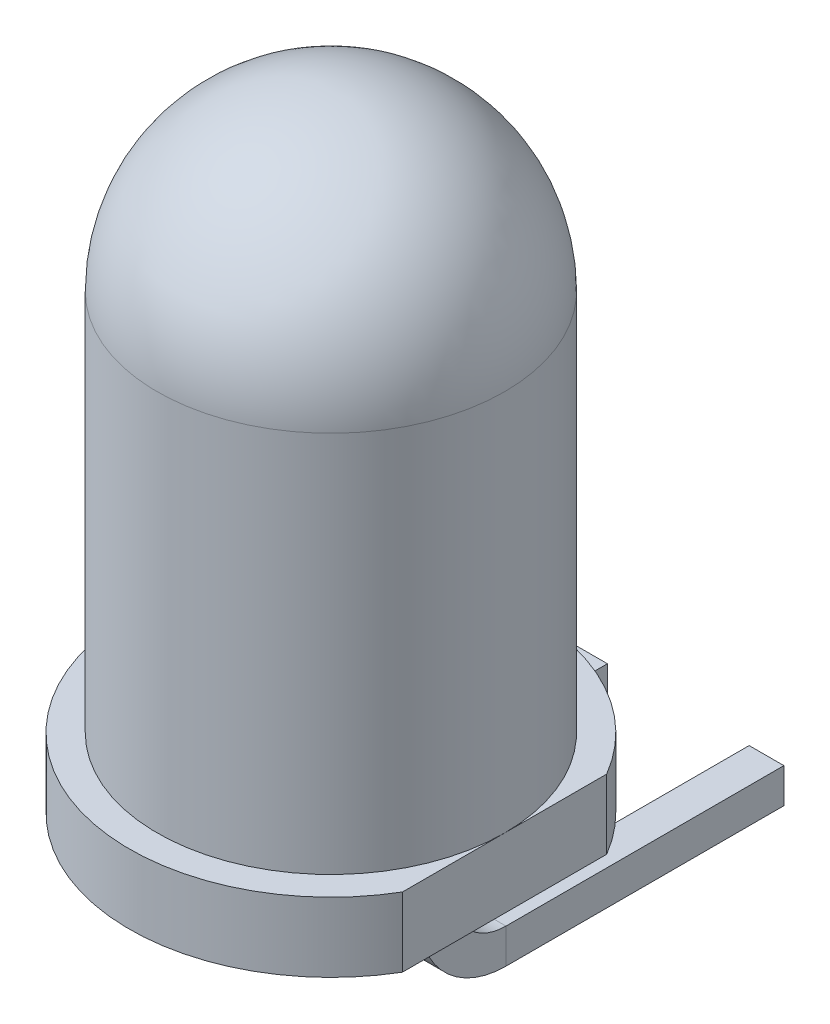
ISO-10303-21;
HEADER;
FILE_DESCRIPTION(('STEP AP214'),'2;1');
FILE_NAME('part.step','',(''),(''),'','','');
FILE_SCHEMA(('AUTOMOTIVE_DESIGN { 1 0 10303 214 1 1 1 1 }'));
ENDSEC;
DATA;
#1=APPLICATION_CONTEXT('core data for automotive mechanical design processes');
#2=APPLICATION_PROTOCOL_DEFINITION('international standard','automotive_design',2000,#1);
#3=PRODUCT_CONTEXT('',#1,'mechanical');
#4=PRODUCT('Part','Part','',(#3));
#5=PRODUCT_RELATED_PRODUCT_CATEGORY('part','',(#4));
#6=PRODUCT_DEFINITION_FORMATION('','',#4);
#7=PRODUCT_DEFINITION_CONTEXT('part definition',#1,'design');
#8=PRODUCT_DEFINITION('design','',#6,#7);
#9=PRODUCT_DEFINITION_SHAPE('','',#8);
#10=(LENGTH_UNIT() NAMED_UNIT(*) SI_UNIT(.MILLI.,.METRE.));
#11=(NAMED_UNIT(*) PLANE_ANGLE_UNIT() SI_UNIT($,.RADIAN.));
#12=(NAMED_UNIT(*) SI_UNIT($,.STERADIAN.) SOLID_ANGLE_UNIT());
#13=UNCERTAINTY_MEASURE_WITH_UNIT(LENGTH_MEASURE(1.E-05),#10,'distance_accuracy_value','');
#14=(GEOMETRIC_REPRESENTATION_CONTEXT(3) GLOBAL_UNCERTAINTY_ASSIGNED_CONTEXT((#13)) GLOBAL_UNIT_ASSIGNED_CONTEXT((#10,
#11,#12)) REPRESENTATION_CONTEXT('',''));
#15=CARTESIAN_POINT('',(0.,0.,0.));
#16=DIRECTION('',(0.,0.,1.));
#17=DIRECTION('',(1.,0.,0.));
#18=AXIS2_PLACEMENT_3D('',#15,#16,#17);
#19=CARTESIAN_POINT('',(2.9,0.,0.));
#20=DIRECTION('',(0.,1.,0.));
#21=DIRECTION('',(0.,0.,1.));
#22=AXIS2_PLACEMENT_3D('',#19,#20,#21);
#23=PLANE('',#22);
#24=DIRECTION('',(0.,0.,1.));
#25=VECTOR('',#24,1.);
#26=CARTESIAN_POINT('',(1.52,0.,-0.25));
#27=LINE('',#26,#25);
#28=CARTESIAN_POINT('',(1.52,0.,-0.25));
#29=VERTEX_POINT('',#28);
#30=CARTESIAN_POINT('',(1.52,0.,0.25));
#31=VERTEX_POINT('',#30);
#32=EDGE_CURVE('E185',#29,#31,#27,.T.);
#33=ORIENTED_EDGE('',*,*,#32,.F.);
#34=DIRECTION('',(1.,0.,0.));
#35=VECTOR('',#34,1.);
#36=CARTESIAN_POINT('',(1.02,0.,-0.25));
#37=LINE('',#36,#35);
#38=CARTESIAN_POINT('',(1.02,0.,-0.25));
#39=VERTEX_POINT('',#38);
#40=EDGE_CURVE('E178',#39,#29,#37,.T.);
#41=ORIENTED_EDGE('',*,*,#40,.F.);
#42=DIRECTION('',(0.,0.,-1.));
#43=VECTOR('',#42,1.);
#44=CARTESIAN_POINT('',(1.02,0.,-0.25));
#45=LINE('',#44,#43);
#46=CARTESIAN_POINT('',(1.02,0.,0.25));
#47=VERTEX_POINT('',#46);
#48=EDGE_CURVE('E165',#47,#39,#45,.T.);
#49=ORIENTED_EDGE('',*,*,#48,.F.);
#50=DIRECTION('',(-1.,0.,0.));
#51=VECTOR('',#50,1.);
#52=CARTESIAN_POINT('',(1.02,0.,0.25));
#53=LINE('',#52,#51);
#54=EDGE_CURVE('E172',#31,#47,#53,.T.);
#55=ORIENTED_EDGE('',*,*,#54,.F.);
#56=EDGE_LOOP('',(#33,#41,#49,#55));
#57=FACE_BOUND('',#56,.T.);
#58=DIRECTION('',(-1.,0.,0.));
#59=VECTOR('',#58,1.);
#60=CARTESIAN_POINT('',(-1.02,0.,0.25));
#61=LINE('',#60,#59);
#62=CARTESIAN_POINT('',(-1.02,0.,0.25));
#63=VERTEX_POINT('',#62);
#64=CARTESIAN_POINT('',(-1.52,0.,0.25));
#65=VERTEX_POINT('',#64);
#66=EDGE_CURVE('E252',#63,#65,#61,.T.);
#67=ORIENTED_EDGE('',*,*,#66,.F.);
#68=DIRECTION('',(0.,0.,1.));
#69=VECTOR('',#68,1.);
#70=CARTESIAN_POINT('',(-1.02,0.,-0.25));
#71=LINE('',#70,#69);
#72=CARTESIAN_POINT('',(-1.02,0.,-0.25));
#73=VERTEX_POINT('',#72);
#74=EDGE_CURVE('E250',#73,#63,#71,.T.);
#75=ORIENTED_EDGE('',*,*,#74,.F.);
#76=DIRECTION('',(1.,0.,0.));
#77=VECTOR('',#76,1.);
#78=CARTESIAN_POINT('',(-1.02,0.,-0.25));
#79=LINE('',#78,#77);
#80=CARTESIAN_POINT('',(-1.52,0.,-0.25));
#81=VERTEX_POINT('',#80);
#82=EDGE_CURVE('E263',#81,#73,#79,.T.);
#83=ORIENTED_EDGE('',*,*,#82,.F.);
#84=DIRECTION('',(0.,0.,-1.));
#85=VECTOR('',#84,1.);
#86=CARTESIAN_POINT('',(-1.52,0.,-0.25));
#87=LINE('',#86,#85);
#88=EDGE_CURVE('E286',#65,#81,#87,.T.);
#89=ORIENTED_EDGE('',*,*,#88,.F.);
#90=EDGE_LOOP('',(#67,#75,#83,#89));
#91=FACE_BOUND('',#90,.T.);
#92=CARTESIAN_POINT('',(0.,0.,0.));
#93=DIRECTION('',(0.,-1.,0.));
#94=DIRECTION('',(0.,0.,-1.));
#95=AXIS2_PLACEMENT_3D('',#92,#93,#94);
#96=CIRCLE('',#95,2.9);
#97=CARTESIAN_POINT('',(2.5,0.,1.4696938456699));
#98=VERTEX_POINT('',#97);
#99=CARTESIAN_POINT('',(2.5,0.,-1.4696938456699));
#100=VERTEX_POINT('',#99);
#101=EDGE_CURVE('E11',#98,#100,#96,.T.);
#102=ORIENTED_EDGE('',*,*,#101,.T.);
#103=DIRECTION('',(0.,0.,-1.));
#104=VECTOR('',#103,1.);
#105=CARTESIAN_POINT('',(2.5,0.,-1.4696938456699));
#106=LINE('',#105,#104);
#107=EDGE_CURVE('E324',#98,#100,#106,.T.);
#108=ORIENTED_EDGE('',*,*,#107,.F.);
#109=EDGE_LOOP('',(#102,#108));
#110=FACE_BOUND('',#109,.T.);
#111=ADVANCED_FACE('F37',(#57,#91,#110),#23,.F.);
#112=CARTESIAN_POINT('',(0.,0.,0.));
#113=DIRECTION('',(0.,-1.,0.));
#114=DIRECTION('',(0.,0.,-1.));
#115=AXIS2_PLACEMENT_3D('',#112,#113,#114);
#116=CYLINDRICAL_SURFACE('',#115,2.9);
#117=CARTESIAN_POINT('',(0.,1.,0.));
#118=DIRECTION('',(0.,-1.,0.));
#119=DIRECTION('',(0.,0.,-1.));
#120=AXIS2_PLACEMENT_3D('',#117,#118,#119);
#121=CIRCLE('',#120,2.9);
#122=CARTESIAN_POINT('',(2.5,1.,1.4696938456699));
#123=VERTEX_POINT('',#122);
#124=CARTESIAN_POINT('',(2.5,1.,-1.4696938456699));
#125=VERTEX_POINT('',#124);
#126=EDGE_CURVE('E44',#123,#125,#121,.T.);
#127=ORIENTED_EDGE('',*,*,#126,.T.);
#128=DIRECTION('',(0.,-1.,0.));
#129=VECTOR('',#128,1.);
#130=CARTESIAN_POINT('',(2.5,9.,-1.4696938456699));
#131=LINE('',#130,#129);
#132=EDGE_CURVE('E327',#125,#100,#131,.T.);
#133=ORIENTED_EDGE('',*,*,#132,.T.);
#134=ORIENTED_EDGE('',*,*,#101,.F.);
#135=DIRECTION('',(0.,-1.,0.));
#136=VECTOR('',#135,1.);
#137=CARTESIAN_POINT('',(2.5,9.,1.4696938456699));
#138=LINE('',#137,#136);
#139=EDGE_CURVE('E326',#123,#98,#138,.T.);
#140=ORIENTED_EDGE('',*,*,#139,.F.);
#141=EDGE_LOOP('',(#127,#133,#134,#140));
#142=FACE_BOUND('',#141,.T.);
#143=ADVANCED_FACE('F344',(#142),#116,.T.);
#144=CARTESIAN_POINT('',(2.5,1.,0.));
#145=DIRECTION('',(0.,-1.,0.));
#146=DIRECTION('',(0.,0.,-1.));
#147=AXIS2_PLACEMENT_3D('',#144,#145,#146);
#148=PLANE('',#147);
#149=ORIENTED_EDGE('',*,*,#126,.F.);
#150=DIRECTION('',(0.,0.,-1.));
#151=VECTOR('',#150,1.);
#152=CARTESIAN_POINT('',(2.5,1.,0.));
#153=LINE('',#152,#151);
#154=CARTESIAN_POINT('',(2.5,1.,0.));
#155=VERTEX_POINT('',#154);
#156=EDGE_CURVE('E334',#123,#155,#153,.T.);
#157=ORIENTED_EDGE('',*,*,#156,.T.);
#158=CARTESIAN_POINT('',(0.,1.,0.));
#159=DIRECTION('',(0.,-1.,0.));
#160=DIRECTION('',(0.,0.,-1.));
#161=AXIS2_PLACEMENT_3D('',#158,#159,#160);
#162=CIRCLE('',#161,2.5);
#163=EDGE_CURVE('E338',#155,#155,#162,.T.);
#164=ORIENTED_EDGE('',*,*,#163,.T.);
#165=EDGE_CURVE('E330',#155,#125,#153,.T.);
#166=ORIENTED_EDGE('',*,*,#165,.T.);
#167=EDGE_LOOP('',(#149,#157,#164,#166));
#168=FACE_BOUND('',#167,.T.);
#169=ADVANCED_FACE('F348',(#168),#148,.F.);
#170=CARTESIAN_POINT('',(0.,0.,0.));
#171=DIRECTION('',(0.,-1.,0.));
#172=DIRECTION('',(0.,0.,-1.));
#173=AXIS2_PLACEMENT_3D('',#170,#171,#172);
#174=CYLINDRICAL_SURFACE('',#173,2.5);
#175=ORIENTED_EDGE('',*,*,#163,.F.);
#176=EDGE_LOOP('',(#175));
#177=FACE_BOUND('',#176,.T.);
#178=CARTESIAN_POINT('',(0.,6.5,0.));
#179=DIRECTION('',(0.,-1.,0.));
#180=DIRECTION('',(0.,0.,-1.));
#181=AXIS2_PLACEMENT_3D('',#178,#179,#180);
#182=CIRCLE('',#181,2.5);
#183=CARTESIAN_POINT('',(0.,6.5,-2.5));
#184=VERTEX_POINT('',#183);
#185=EDGE_CURVE('E335',#184,#184,#182,.T.);
#186=ORIENTED_EDGE('',*,*,#185,.T.);
#187=EDGE_LOOP('',(#186));
#188=FACE_BOUND('',#187,.T.);
#189=ADVANCED_FACE('F361',(#177,#188),#174,.T.);
#190=CARTESIAN_POINT('',(0.,6.5,0.));
#191=DIRECTION('',(0.,-1.,0.));
#192=DIRECTION('',(1.,0.,0.));
#193=AXIS2_PLACEMENT_3D('',#190,#191,#192);
#194=SPHERICAL_SURFACE('',#193,2.5);
#195=ORIENTED_EDGE('',*,*,#185,.F.);
#196=EDGE_LOOP('',(#195));
#197=FACE_BOUND('',#196,.T.);
#198=ADVANCED_FACE('F366',(#197),#194,.T.);
#199=CARTESIAN_POINT('',(2.5,9.,-1.4696938456699));
#200=DIRECTION('',(-1.,0.,0.));
#201=DIRECTION('',(0.,0.,1.));
#202=AXIS2_PLACEMENT_3D('',#199,#200,#201);
#203=PLANE('',#202);
#204=ORIENTED_EDGE('',*,*,#139,.T.);
#205=ORIENTED_EDGE('',*,*,#107,.T.);
#206=ORIENTED_EDGE('',*,*,#132,.F.);
#207=ORIENTED_EDGE('',*,*,#165,.F.);
#208=ORIENTED_EDGE('',*,*,#156,.F.);
#209=EDGE_LOOP('',(#204,#205,#206,#207,#208));
#210=FACE_BOUND('',#209,.T.);
#211=ADVANCED_FACE('F351',(#210),#203,.F.);
#212=CARTESIAN_POINT('',(0.,-1.4,-5.));
#213=DIRECTION('',(0.,0.,-1.));
#214=DIRECTION('',(0.,1.,0.));
#215=AXIS2_PLACEMENT_3D('',#212,#213,#214);
#216=PLANE('',#215);
#217=DIRECTION('',(0.,1.,0.));
#218=VECTOR('',#217,1.);
#219=CARTESIAN_POINT('',(-1.52,-1.15,-5.));
#220=LINE('',#219,#218);
#221=CARTESIAN_POINT('',(-1.52,-1.65,-5.));
#222=VERTEX_POINT('',#221);
#223=CARTESIAN_POINT('',(-1.52,-1.15,-5.));
#224=VERTEX_POINT('',#223);
#225=EDGE_CURVE('E303',#222,#224,#220,.T.);
#226=ORIENTED_EDGE('',*,*,#225,.T.);
#227=DIRECTION('',(1.,0.,0.));
#228=VECTOR('',#227,1.);
#229=CARTESIAN_POINT('',(-1.02,-1.15,-5.));
#230=LINE('',#229,#228);
#231=CARTESIAN_POINT('',(-1.02,-1.15,-5.));
#232=VERTEX_POINT('',#231);
#233=EDGE_CURVE('E317',#224,#232,#230,.T.);
#234=ORIENTED_EDGE('',*,*,#233,.T.);
#235=DIRECTION('',(0.,-1.,0.));
#236=VECTOR('',#235,1.);
#237=CARTESIAN_POINT('',(-1.02,-1.15,-5.));
#238=LINE('',#237,#236);
#239=CARTESIAN_POINT('',(-1.02,-1.65,-5.));
#240=VERTEX_POINT('',#239);
#241=EDGE_CURVE('E275',#232,#240,#238,.T.);
#242=ORIENTED_EDGE('',*,*,#241,.T.);
#243=DIRECTION('',(-1.,0.,0.));
#244=VECTOR('',#243,1.);
#245=CARTESIAN_POINT('',(-1.02,-1.65,-5.));
#246=LINE('',#245,#244);
#247=EDGE_CURVE('E281',#240,#222,#246,.T.);
#248=ORIENTED_EDGE('',*,*,#247,.T.);
#249=EDGE_LOOP('',(#226,#234,#242,#248));
#250=FACE_BOUND('',#249,.T.);
#251=ADVANCED_FACE('F373',(#250),#216,.T.);
#252=CARTESIAN_POINT('',(-1.02,0.,-0.25));
#253=DIRECTION('',(1.,0.,0.));
#254=DIRECTION('',(0.,0.,-1.));
#255=AXIS2_PLACEMENT_3D('',#252,#253,#254);
#256=PLANE('',#255);
#257=DIRECTION('',(0.,-1.,0.));
#258=VECTOR('',#257,1.);
#259=CARTESIAN_POINT('',(-1.02,0.,0.25));
#260=LINE('',#259,#258);
#261=CARTESIAN_POINT('',(-1.02,-0.4,0.25));
#262=VERTEX_POINT('',#261);
#263=EDGE_CURVE('E256',#63,#262,#260,.T.);
#264=ORIENTED_EDGE('',*,*,#263,.T.);
#265=DIRECTION('',(0.,0.,1.));
#266=VECTOR('',#265,1.);
#267=CARTESIAN_POINT('',(-1.02,-0.4,-0.25));
#268=LINE('',#267,#266);
#269=CARTESIAN_POINT('',(-1.02,-0.4,-0.25));
#270=VERTEX_POINT('',#269);
#271=EDGE_CURVE('E253',#270,#262,#268,.T.);
#272=ORIENTED_EDGE('',*,*,#271,.F.);
#273=DIRECTION('',(0.,-1.,0.));
#274=VECTOR('',#273,1.);
#275=CARTESIAN_POINT('',(-1.02,0.,-0.25));
#276=LINE('',#275,#274);
#277=EDGE_CURVE('E257',#73,#270,#276,.T.);
#278=ORIENTED_EDGE('',*,*,#277,.F.);
#279=ORIENTED_EDGE('',*,*,#74,.T.);
#280=EDGE_LOOP('',(#264,#272,#278,#279));
#281=FACE_BOUND('',#280,.T.);
#282=ADVANCED_FACE('F377',(#281),#256,.T.);
#283=CARTESIAN_POINT('',(-1.02,0.,0.25));
#284=DIRECTION('',(0.,0.,1.));
#285=DIRECTION('',(1.,0.,0.));
#286=AXIS2_PLACEMENT_3D('',#283,#284,#285);
#287=PLANE('',#286);
#288=DIRECTION('',(0.,-1.,0.));
#289=VECTOR('',#288,1.);
#290=CARTESIAN_POINT('',(-1.52,0.,0.25));
#291=LINE('',#290,#289);
#292=CARTESIAN_POINT('',(-1.52,-0.4,0.25));
#293=VERTEX_POINT('',#292);
#294=EDGE_CURVE('E289',#65,#293,#291,.T.);
#295=ORIENTED_EDGE('',*,*,#294,.T.);
#296=DIRECTION('',(-1.,0.,0.));
#297=VECTOR('',#296,1.);
#298=CARTESIAN_POINT('',(-1.02,-0.4,0.25));
#299=LINE('',#298,#297);
#300=EDGE_CURVE('E260',#262,#293,#299,.T.);
#301=ORIENTED_EDGE('',*,*,#300,.F.);
#302=ORIENTED_EDGE('',*,*,#263,.F.);
#303=ORIENTED_EDGE('',*,*,#66,.T.);
#304=EDGE_LOOP('',(#295,#301,#302,#303));
#305=FACE_BOUND('',#304,.T.);
#306=ADVANCED_FACE('F406',(#305),#287,.T.);
#307=CARTESIAN_POINT('',(-1.52,0.,-0.25));
#308=DIRECTION('',(-1.,0.,0.));
#309=DIRECTION('',(0.,0.,1.));
#310=AXIS2_PLACEMENT_3D('',#307,#308,#309);
#311=PLANE('',#310);
#312=DIRECTION('',(0.,-1.,0.));
#313=VECTOR('',#312,1.);
#314=CARTESIAN_POINT('',(-1.52,0.,-0.25));
#315=LINE('',#314,#313);
#316=CARTESIAN_POINT('',(-1.52,-0.4,-0.25));
#317=VERTEX_POINT('',#316);
#318=EDGE_CURVE('E59',#81,#317,#315,.T.);
#319=ORIENTED_EDGE('',*,*,#318,.T.);
#320=DIRECTION('',(0.,0.,-1.));
#321=VECTOR('',#320,1.);
#322=CARTESIAN_POINT('',(-1.52,-0.4,-0.25));
#323=LINE('',#322,#321);
#324=EDGE_CURVE('E292',#293,#317,#323,.T.);
#325=ORIENTED_EDGE('',*,*,#324,.F.);
#326=ORIENTED_EDGE('',*,*,#294,.F.);
#327=ORIENTED_EDGE('',*,*,#88,.T.);
#328=EDGE_LOOP('',(#319,#325,#326,#327));
#329=FACE_BOUND('',#328,.T.);
#330=ADVANCED_FACE('F395',(#329),#311,.T.);
#331=CARTESIAN_POINT('',(-1.02,0.,-0.25));
#332=DIRECTION('',(0.,0.,-1.));
#333=DIRECTION('',(-1.,0.,0.));
#334=AXIS2_PLACEMENT_3D('',#331,#332,#333);
#335=PLANE('',#334);
#336=DIRECTION('',(1.,0.,0.));
#337=VECTOR('',#336,1.);
#338=CARTESIAN_POINT('',(-1.02,-0.4,-0.25));
#339=LINE('',#338,#337);
#340=EDGE_CURVE('E274',#317,#270,#339,.T.);
#341=ORIENTED_EDGE('',*,*,#340,.F.);
#342=ORIENTED_EDGE('',*,*,#318,.F.);
#343=ORIENTED_EDGE('',*,*,#82,.T.);
#344=ORIENTED_EDGE('',*,*,#277,.T.);
#345=EDGE_LOOP('',(#341,#342,#343,#344));
#346=FACE_BOUND('',#345,.T.);
#347=ADVANCED_FACE('F391',(#346),#335,.T.);
#348=CARTESIAN_POINT('',(-1.02,-0.4,-0.25));
#349=DIRECTION('',(1.,0.,0.));
#350=DIRECTION('',(0.,0.,-1.));
#351=AXIS2_PLACEMENT_3D('',#348,#349,#350);
#352=PLANE('',#351);
#353=CARTESIAN_POINT('',(-1.02,-0.4,-1.));
#354=DIRECTION('',(1.,0.,0.));
#355=DIRECTION('',(0.,0.,1.));
#356=AXIS2_PLACEMENT_3D('',#353,#354,#355);
#357=CIRCLE('',#356,1.25);
#358=CARTESIAN_POINT('',(-1.02,-1.65,-1.));
#359=VERTEX_POINT('',#358);
#360=EDGE_CURVE('E267',#262,#359,#357,.T.);
#361=ORIENTED_EDGE('',*,*,#360,.T.);
#362=DIRECTION('',(0.,-1.,0.));
#363=VECTOR('',#362,1.);
#364=CARTESIAN_POINT('',(-1.02,-1.15,-1.));
#365=LINE('',#364,#363);
#366=CARTESIAN_POINT('',(-1.02,-1.15,-1.));
#367=VERTEX_POINT('',#366);
#368=EDGE_CURVE('E264',#367,#359,#365,.T.);
#369=ORIENTED_EDGE('',*,*,#368,.F.);
#370=CARTESIAN_POINT('',(-1.02,-0.4,-1.));
#371=DIRECTION('',(1.,0.,0.));
#372=DIRECTION('',(0.,0.,1.));
#373=AXIS2_PLACEMENT_3D('',#370,#371,#372);
#374=CIRCLE('',#373,0.75);
#375=EDGE_CURVE('E268',#270,#367,#374,.T.);
#376=ORIENTED_EDGE('',*,*,#375,.F.);
#377=ORIENTED_EDGE('',*,*,#271,.T.);
#378=EDGE_LOOP('',(#361,#369,#376,#377));
#379=FACE_BOUND('',#378,.T.);
#380=ADVANCED_FACE('F394',(#379),#352,.T.);
#381=CARTESIAN_POINT('',(-1.27,-0.4,-1.));
#382=DIRECTION('',(1.,0.,0.));
#383=DIRECTION('',(0.,0.,-1.));
#384=AXIS2_PLACEMENT_3D('',#381,#382,#383);
#385=CYLINDRICAL_SURFACE('',#384,1.25);
#386=CARTESIAN_POINT('',(-1.52,-0.4,-1.));
#387=DIRECTION('',(1.,0.,0.));
#388=DIRECTION('',(0.,0.,1.));
#389=AXIS2_PLACEMENT_3D('',#386,#387,#388);
#390=CIRCLE('',#389,1.25);
#391=CARTESIAN_POINT('',(-1.52,-1.65,-1.));
#392=VERTEX_POINT('',#391);
#393=EDGE_CURVE('E295',#293,#392,#390,.T.);
#394=ORIENTED_EDGE('',*,*,#393,.T.);
#395=DIRECTION('',(-1.,0.,0.));
#396=VECTOR('',#395,1.);
#397=CARTESIAN_POINT('',(-1.02,-1.65,-1.));
#398=LINE('',#397,#396);
#399=EDGE_CURVE('E271',#359,#392,#398,.T.);
#400=ORIENTED_EDGE('',*,*,#399,.F.);
#401=ORIENTED_EDGE('',*,*,#360,.F.);
#402=ORIENTED_EDGE('',*,*,#300,.T.);
#403=EDGE_LOOP('',(#394,#400,#401,#402));
#404=FACE_BOUND('',#403,.T.);
#405=ADVANCED_FACE('F402',(#404),#385,.T.);
#406=CARTESIAN_POINT('',(-1.52,-0.4,-0.25));
#407=DIRECTION('',(-1.,0.,0.));
#408=DIRECTION('',(0.,0.,1.));
#409=AXIS2_PLACEMENT_3D('',#406,#407,#408);
#410=PLANE('',#409);
#411=CARTESIAN_POINT('',(-1.52,-0.4,-1.));
#412=DIRECTION('',(1.,0.,0.));
#413=DIRECTION('',(0.,0.,1.));
#414=AXIS2_PLACEMENT_3D('',#411,#412,#413);
#415=CIRCLE('',#414,0.75);
#416=CARTESIAN_POINT('',(-1.52,-1.15,-1.));
#417=VERTEX_POINT('',#416);
#418=EDGE_CURVE('E310',#317,#417,#415,.T.);
#419=ORIENTED_EDGE('',*,*,#418,.T.);
#420=DIRECTION('',(0.,1.,0.));
#421=VECTOR('',#420,1.);
#422=CARTESIAN_POINT('',(-1.52,-1.15,-1.));
#423=LINE('',#422,#421);
#424=EDGE_CURVE('E298',#392,#417,#423,.T.);
#425=ORIENTED_EDGE('',*,*,#424,.F.);
#426=ORIENTED_EDGE('',*,*,#393,.F.);
#427=ORIENTED_EDGE('',*,*,#324,.T.);
#428=EDGE_LOOP('',(#419,#425,#426,#427));
#429=FACE_BOUND('',#428,.T.);
#430=ADVANCED_FACE('F389',(#429),#410,.T.);
#431=CARTESIAN_POINT('',(-1.27,-0.4,-1.));
#432=DIRECTION('',(1.,0.,0.));
#433=DIRECTION('',(0.,0.,-1.));
#434=AXIS2_PLACEMENT_3D('',#431,#432,#433);
#435=CYLINDRICAL_SURFACE('',#434,0.75);
#436=DIRECTION('',(1.,0.,0.));
#437=VECTOR('',#436,1.);
#438=CARTESIAN_POINT('',(-1.02,-1.15,-1.));
#439=LINE('',#438,#437);
#440=EDGE_CURVE('E284',#417,#367,#439,.T.);
#441=ORIENTED_EDGE('',*,*,#440,.F.);
#442=ORIENTED_EDGE('',*,*,#418,.F.);
#443=ORIENTED_EDGE('',*,*,#340,.T.);
#444=ORIENTED_EDGE('',*,*,#375,.T.);
#445=EDGE_LOOP('',(#441,#442,#443,#444));
#446=FACE_BOUND('',#445,.T.);
#447=ADVANCED_FACE('F385',(#446),#435,.F.);
#448=CARTESIAN_POINT('',(-1.02,-1.15,-1.));
#449=DIRECTION('',(1.,0.,0.));
#450=DIRECTION('',(0.,0.,-1.));
#451=AXIS2_PLACEMENT_3D('',#448,#449,#450);
#452=PLANE('',#451);
#453=DIRECTION('',(0.,0.,-1.));
#454=VECTOR('',#453,1.);
#455=CARTESIAN_POINT('',(-1.02,-1.65,-1.));
#456=LINE('',#455,#454);
#457=EDGE_CURVE('E277',#359,#240,#456,.T.);
#458=ORIENTED_EDGE('',*,*,#457,.T.);
#459=ORIENTED_EDGE('',*,*,#241,.F.);
#460=DIRECTION('',(0.,0.,-1.));
#461=VECTOR('',#460,1.);
#462=CARTESIAN_POINT('',(-1.02,-1.15,-1.));
#463=LINE('',#462,#461);
#464=EDGE_CURVE('E278',#367,#232,#463,.T.);
#465=ORIENTED_EDGE('',*,*,#464,.F.);
#466=ORIENTED_EDGE('',*,*,#368,.T.);
#467=EDGE_LOOP('',(#458,#459,#465,#466));
#468=FACE_BOUND('',#467,.T.);
#469=ADVANCED_FACE('F388',(#468),#452,.T.);
#470=CARTESIAN_POINT('',(-1.02,-1.65,-1.));
#471=DIRECTION('',(0.,-1.,0.));
#472=DIRECTION('',(0.,0.,-1.));
#473=AXIS2_PLACEMENT_3D('',#470,#471,#472);
#474=PLANE('',#473);
#475=DIRECTION('',(0.,0.,-1.));
#476=VECTOR('',#475,1.);
#477=CARTESIAN_POINT('',(-1.52,-1.65,-1.));
#478=LINE('',#477,#476);
#479=EDGE_CURVE('E300',#392,#222,#478,.T.);
#480=ORIENTED_EDGE('',*,*,#479,.T.);
#481=ORIENTED_EDGE('',*,*,#247,.F.);
#482=ORIENTED_EDGE('',*,*,#457,.F.);
#483=ORIENTED_EDGE('',*,*,#399,.T.);
#484=EDGE_LOOP('',(#480,#481,#482,#483));
#485=FACE_BOUND('',#484,.T.);
#486=ADVANCED_FACE('F398',(#485),#474,.T.);
#487=CARTESIAN_POINT('',(-1.52,-1.15,-1.));
#488=DIRECTION('',(-1.,0.,0.));
#489=DIRECTION('',(0.,0.,1.));
#490=AXIS2_PLACEMENT_3D('',#487,#488,#489);
#491=PLANE('',#490);
#492=DIRECTION('',(0.,0.,-1.));
#493=VECTOR('',#492,1.);
#494=CARTESIAN_POINT('',(-1.52,-1.15,-1.));
#495=LINE('',#494,#493);
#496=EDGE_CURVE('E314',#417,#224,#495,.T.);
#497=ORIENTED_EDGE('',*,*,#496,.T.);
#498=ORIENTED_EDGE('',*,*,#225,.F.);
#499=ORIENTED_EDGE('',*,*,#479,.F.);
#500=ORIENTED_EDGE('',*,*,#424,.T.);
#501=EDGE_LOOP('',(#497,#498,#499,#500));
#502=FACE_BOUND('',#501,.T.);
#503=ADVANCED_FACE('F383',(#502),#491,.T.);
#504=CARTESIAN_POINT('',(-1.02,-1.15,-1.));
#505=DIRECTION('',(0.,1.,0.));
#506=DIRECTION('',(0.,0.,1.));
#507=AXIS2_PLACEMENT_3D('',#504,#505,#506);
#508=PLANE('',#507);
#509=ORIENTED_EDGE('',*,*,#233,.F.);
#510=ORIENTED_EDGE('',*,*,#496,.F.);
#511=ORIENTED_EDGE('',*,*,#440,.T.);
#512=ORIENTED_EDGE('',*,*,#464,.T.);
#513=EDGE_LOOP('',(#509,#510,#511,#512));
#514=FACE_BOUND('',#513,.T.);
#515=ADVANCED_FACE('F374',(#514),#508,.T.);
#516=CARTESIAN_POINT('',(0.,-1.4,-5.));
#517=DIRECTION('',(0.,0.,-1.));
#518=DIRECTION('',(0.,1.,0.));
#519=AXIS2_PLACEMENT_3D('',#516,#517,#518);
#520=PLANE('',#519);
#521=DIRECTION('',(1.,0.,0.));
#522=VECTOR('',#521,1.);
#523=CARTESIAN_POINT('',(1.02,-1.15,-5.));
#524=LINE('',#523,#522);
#525=CARTESIAN_POINT('',(1.02,-1.15,-5.));
#526=VERTEX_POINT('',#525);
#527=CARTESIAN_POINT('',(1.52,-1.15,-5.));
#528=VERTEX_POINT('',#527);
#529=EDGE_CURVE('E204',#526,#528,#524,.T.);
#530=ORIENTED_EDGE('',*,*,#529,.T.);
#531=DIRECTION('',(0.,-1.,0.));
#532=VECTOR('',#531,1.);
#533=CARTESIAN_POINT('',(1.52,-1.15,-5.));
#534=LINE('',#533,#532);
#535=CARTESIAN_POINT('',(1.52,-1.65,-5.));
#536=VERTEX_POINT('',#535);
#537=EDGE_CURVE('E210',#528,#536,#534,.T.);
#538=ORIENTED_EDGE('',*,*,#537,.T.);
#539=DIRECTION('',(-1.,0.,0.));
#540=VECTOR('',#539,1.);
#541=CARTESIAN_POINT('',(1.02,-1.65,-5.));
#542=LINE('',#541,#540);
#543=CARTESIAN_POINT('',(1.02,-1.65,-5.));
#544=VERTEX_POINT('',#543);
#545=EDGE_CURVE('E230',#536,#544,#542,.T.);
#546=ORIENTED_EDGE('',*,*,#545,.T.);
#547=DIRECTION('',(0.,1.,0.));
#548=VECTOR('',#547,1.);
#549=CARTESIAN_POINT('',(1.02,-1.15,-5.));
#550=LINE('',#549,#548);
#551=EDGE_CURVE('E243',#544,#526,#550,.T.);
#552=ORIENTED_EDGE('',*,*,#551,.T.);
#553=EDGE_LOOP('',(#530,#538,#546,#552));
#554=FACE_BOUND('',#553,.T.);
#555=ADVANCED_FACE('F382',(#554),#520,.T.);
#556=CARTESIAN_POINT('',(1.02,0.,-0.25));
#557=DIRECTION('',(0.,0.,-1.));
#558=DIRECTION('',(-1.,0.,0.));
#559=AXIS2_PLACEMENT_3D('',#556,#557,#558);
#560=PLANE('',#559);
#561=DIRECTION('',(0.,-1.,0.));
#562=VECTOR('',#561,1.);
#563=CARTESIAN_POINT('',(1.52,0.,-0.25));
#564=LINE('',#563,#562);
#565=CARTESIAN_POINT('',(1.52,-0.4,-0.25));
#566=VERTEX_POINT('',#565);
#567=EDGE_CURVE('E190',#29,#566,#564,.T.);
#568=ORIENTED_EDGE('',*,*,#567,.T.);
#569=DIRECTION('',(1.,0.,0.));
#570=VECTOR('',#569,1.);
#571=CARTESIAN_POINT('',(1.02,-0.4,-0.25));
#572=LINE('',#571,#570);
#573=CARTESIAN_POINT('',(1.02,-0.4,-0.25));
#574=VERTEX_POINT('',#573);
#575=EDGE_CURVE('E181',#574,#566,#572,.T.);
#576=ORIENTED_EDGE('',*,*,#575,.F.);
#577=DIRECTION('',(0.,-1.,0.));
#578=VECTOR('',#577,1.);
#579=CARTESIAN_POINT('',(1.02,0.,-0.25));
#580=LINE('',#579,#578);
#581=EDGE_CURVE('E168',#39,#574,#580,.T.);
#582=ORIENTED_EDGE('',*,*,#581,.F.);
#583=ORIENTED_EDGE('',*,*,#40,.T.);
#584=EDGE_LOOP('',(#568,#576,#582,#583));
#585=FACE_BOUND('',#584,.T.);
#586=ADVANCED_FACE('F177',(#585),#560,.T.);
#587=CARTESIAN_POINT('',(1.52,0.,-0.25));
#588=DIRECTION('',(1.,0.,0.));
#589=DIRECTION('',(0.,0.,-1.));
#590=AXIS2_PLACEMENT_3D('',#587,#588,#589);
#591=PLANE('',#590);
#592=DIRECTION('',(0.,-1.,0.));
#593=VECTOR('',#592,1.);
#594=CARTESIAN_POINT('',(1.52,0.,0.25));
#595=LINE('',#594,#593);
#596=CARTESIAN_POINT('',(1.52,-0.4,0.25));
#597=VERTEX_POINT('',#596);
#598=EDGE_CURVE('E216',#31,#597,#595,.T.);
#599=ORIENTED_EDGE('',*,*,#598,.T.);
#600=DIRECTION('',(0.,0.,1.));
#601=VECTOR('',#600,1.);
#602=CARTESIAN_POINT('',(1.52,-0.4,-0.25));
#603=LINE('',#602,#601);
#604=EDGE_CURVE('E191',#566,#597,#603,.T.);
#605=ORIENTED_EDGE('',*,*,#604,.F.);
#606=ORIENTED_EDGE('',*,*,#567,.F.);
#607=ORIENTED_EDGE('',*,*,#32,.T.);
#608=EDGE_LOOP('',(#599,#605,#606,#607));
#609=FACE_BOUND('',#608,.T.);
#610=ADVANCED_FACE('F453',(#609),#591,.T.);
#611=CARTESIAN_POINT('',(1.02,0.,0.25));
#612=DIRECTION('',(0.,0.,1.));
#613=DIRECTION('',(1.,0.,0.));
#614=AXIS2_PLACEMENT_3D('',#611,#612,#613);
#615=PLANE('',#614);
#616=DIRECTION('',(0.,-1.,0.));
#617=VECTOR('',#616,1.);
#618=CARTESIAN_POINT('',(1.02,0.,0.25));
#619=LINE('',#618,#617);
#620=CARTESIAN_POINT('',(1.02,-0.4,0.25));
#621=VERTEX_POINT('',#620);
#622=EDGE_CURVE('E51',#47,#621,#619,.T.);
#623=ORIENTED_EDGE('',*,*,#622,.T.);
#624=DIRECTION('',(-1.,0.,0.));
#625=VECTOR('',#624,1.);
#626=CARTESIAN_POINT('',(1.02,-0.4,0.25));
#627=LINE('',#626,#625);
#628=EDGE_CURVE('E219',#597,#621,#627,.T.);
#629=ORIENTED_EDGE('',*,*,#628,.F.);
#630=ORIENTED_EDGE('',*,*,#598,.F.);
#631=ORIENTED_EDGE('',*,*,#54,.T.);
#632=EDGE_LOOP('',(#623,#629,#630,#631));
#633=FACE_BOUND('',#632,.T.);
#634=ADVANCED_FACE('F442',(#633),#615,.T.);
#635=CARTESIAN_POINT('',(1.02,0.,-0.25));
#636=DIRECTION('',(-1.,0.,0.));
#637=DIRECTION('',(0.,0.,1.));
#638=AXIS2_PLACEMENT_3D('',#635,#636,#637);
#639=PLANE('',#638);
#640=DIRECTION('',(0.,0.,-1.));
#641=VECTOR('',#640,1.);
#642=CARTESIAN_POINT('',(1.02,-0.4,-0.25));
#643=LINE('',#642,#641);
#644=EDGE_CURVE('E203',#621,#574,#643,.T.);
#645=ORIENTED_EDGE('',*,*,#644,.F.);
#646=ORIENTED_EDGE('',*,*,#622,.F.);
#647=ORIENTED_EDGE('',*,*,#48,.T.);
#648=ORIENTED_EDGE('',*,*,#581,.T.);
#649=EDGE_LOOP('',(#645,#646,#647,#648));
#650=FACE_BOUND('',#649,.T.);
#651=ADVANCED_FACE('F167',(#650),#639,.T.);
#652=CARTESIAN_POINT('',(-1.27,-0.4,-1.));
#653=DIRECTION('',(1.,0.,0.));
#654=DIRECTION('',(0.,0.,-1.));
#655=AXIS2_PLACEMENT_3D('',#652,#653,#654);
#656=CYLINDRICAL_SURFACE('',#655,0.75);
#657=CARTESIAN_POINT('',(1.52,-0.4,-1.));
#658=DIRECTION('',(1.,0.,0.));
#659=DIRECTION('',(0.,0.,1.));
#660=AXIS2_PLACEMENT_3D('',#657,#658,#659);
#661=CIRCLE('',#660,0.75);
#662=CARTESIAN_POINT('',(1.52,-1.15,-1.));
#663=VERTEX_POINT('',#662);
#664=EDGE_CURVE('E196',#566,#663,#661,.T.);
#665=ORIENTED_EDGE('',*,*,#664,.T.);
#666=DIRECTION('',(1.,0.,0.));
#667=VECTOR('',#666,1.);
#668=CARTESIAN_POINT('',(1.02,-1.15,-1.));
#669=LINE('',#668,#667);
#670=CARTESIAN_POINT('',(1.02,-1.15,-1.));
#671=VERTEX_POINT('',#670);
#672=EDGE_CURVE('E193',#671,#663,#669,.T.);
#673=ORIENTED_EDGE('',*,*,#672,.F.);
#674=CARTESIAN_POINT('',(1.02,-0.4,-1.));
#675=DIRECTION('',(1.,0.,0.));
#676=DIRECTION('',(0.,0.,1.));
#677=AXIS2_PLACEMENT_3D('',#674,#675,#676);
#678=CIRCLE('',#677,0.75);
#679=EDGE_CURVE('E197',#574,#671,#678,.T.);
#680=ORIENTED_EDGE('',*,*,#679,.F.);
#681=ORIENTED_EDGE('',*,*,#575,.T.);
#682=EDGE_LOOP('',(#665,#673,#680,#681));
#683=FACE_BOUND('',#682,.T.);
#684=ADVANCED_FACE('F441',(#683),#656,.F.);
#685=CARTESIAN_POINT('',(1.52,-0.4,-0.25));
#686=DIRECTION('',(1.,0.,0.));
#687=DIRECTION('',(0.,0.,-1.));
#688=AXIS2_PLACEMENT_3D('',#685,#686,#687);
#689=PLANE('',#688);
#690=CARTESIAN_POINT('',(1.52,-0.4,-1.));
#691=DIRECTION('',(1.,0.,0.));
#692=DIRECTION('',(0.,0.,1.));
#693=AXIS2_PLACEMENT_3D('',#690,#691,#692);
#694=CIRCLE('',#693,1.25);
#695=CARTESIAN_POINT('',(1.52,-1.65,-1.));
#696=VERTEX_POINT('',#695);
#697=EDGE_CURVE('E222',#597,#696,#694,.T.);
#698=ORIENTED_EDGE('',*,*,#697,.T.);
#699=DIRECTION('',(0.,-1.,0.));
#700=VECTOR('',#699,1.);
#701=CARTESIAN_POINT('',(1.52,-1.15,-1.));
#702=LINE('',#701,#700);
#703=EDGE_CURVE('E200',#663,#696,#702,.T.);
#704=ORIENTED_EDGE('',*,*,#703,.F.);
#705=ORIENTED_EDGE('',*,*,#664,.F.);
#706=ORIENTED_EDGE('',*,*,#604,.T.);
#707=EDGE_LOOP('',(#698,#704,#705,#706));
#708=FACE_BOUND('',#707,.T.);
#709=ADVANCED_FACE('F449',(#708),#689,.T.);
#710=CARTESIAN_POINT('',(-1.27,-0.4,-1.));
#711=DIRECTION('',(1.,0.,0.));
#712=DIRECTION('',(0.,0.,-1.));
#713=AXIS2_PLACEMENT_3D('',#710,#711,#712);
#714=CYLINDRICAL_SURFACE('',#713,1.25);
#715=CARTESIAN_POINT('',(1.02,-0.4,-1.));
#716=DIRECTION('',(1.,0.,0.));
#717=DIRECTION('',(0.,0.,1.));
#718=AXIS2_PLACEMENT_3D('',#715,#716,#717);
#719=CIRCLE('',#718,1.25);
#720=CARTESIAN_POINT('',(1.02,-1.65,-1.));
#721=VERTEX_POINT('',#720);
#722=EDGE_CURVE('E237',#621,#721,#719,.T.);
#723=ORIENTED_EDGE('',*,*,#722,.T.);
#724=DIRECTION('',(-1.,0.,0.));
#725=VECTOR('',#724,1.);
#726=CARTESIAN_POINT('',(1.02,-1.65,-1.));
#727=LINE('',#726,#725);
#728=EDGE_CURVE('E225',#696,#721,#727,.T.);
#729=ORIENTED_EDGE('',*,*,#728,.F.);
#730=ORIENTED_EDGE('',*,*,#697,.F.);
#731=ORIENTED_EDGE('',*,*,#628,.T.);
#732=EDGE_LOOP('',(#723,#729,#730,#731));
#733=FACE_BOUND('',#732,.T.);
#734=ADVANCED_FACE('F437',(#733),#714,.T.);
#735=CARTESIAN_POINT('',(1.02,-0.4,-0.25));
#736=DIRECTION('',(-1.,0.,0.));
#737=DIRECTION('',(0.,0.,1.));
#738=AXIS2_PLACEMENT_3D('',#735,#736,#737);
#739=PLANE('',#738);
#740=DIRECTION('',(0.,1.,0.));
#741=VECTOR('',#740,1.);
#742=CARTESIAN_POINT('',(1.02,-1.15,-1.));
#743=LINE('',#742,#741);
#744=EDGE_CURVE('E212',#721,#671,#743,.T.);
#745=ORIENTED_EDGE('',*,*,#744,.F.);
#746=ORIENTED_EDGE('',*,*,#722,.F.);
#747=ORIENTED_EDGE('',*,*,#644,.T.);
#748=ORIENTED_EDGE('',*,*,#679,.T.);
#749=EDGE_LOOP('',(#745,#746,#747,#748));
#750=FACE_BOUND('',#749,.T.);
#751=ADVANCED_FACE('F433',(#750),#739,.T.);
#752=CARTESIAN_POINT('',(1.02,-1.15,-1.));
#753=DIRECTION('',(0.,1.,0.));
#754=DIRECTION('',(-1.,0.,0.));
#755=AXIS2_PLACEMENT_3D('',#752,#753,#754);
#756=PLANE('',#755);
#757=DIRECTION('',(0.,0.,-1.));
#758=VECTOR('',#757,1.);
#759=CARTESIAN_POINT('',(1.52,-1.15,-1.));
#760=LINE('',#759,#758);
#761=EDGE_CURVE('E206',#663,#528,#760,.T.);
#762=ORIENTED_EDGE('',*,*,#761,.T.);
#763=ORIENTED_EDGE('',*,*,#529,.F.);
#764=DIRECTION('',(0.,0.,-1.));
#765=VECTOR('',#764,1.);
#766=CARTESIAN_POINT('',(1.02,-1.15,-1.));
#767=LINE('',#766,#765);
#768=EDGE_CURVE('E207',#671,#526,#767,.T.);
#769=ORIENTED_EDGE('',*,*,#768,.F.);
#770=ORIENTED_EDGE('',*,*,#672,.T.);
#771=EDGE_LOOP('',(#762,#763,#769,#770));
#772=FACE_BOUND('',#771,.T.);
#773=ADVANCED_FACE('F436',(#772),#756,.T.);
#774=CARTESIAN_POINT('',(1.52,-1.15,-1.));
#775=DIRECTION('',(1.,0.,0.));
#776=DIRECTION('',(0.,0.,-1.));
#777=AXIS2_PLACEMENT_3D('',#774,#775,#776);
#778=PLANE('',#777);
#779=DIRECTION('',(0.,0.,-1.));
#780=VECTOR('',#779,1.);
#781=CARTESIAN_POINT('',(1.52,-1.65,-1.));
#782=LINE('',#781,#780);
#783=EDGE_CURVE('E227',#696,#536,#782,.T.);
#784=ORIENTED_EDGE('',*,*,#783,.T.);
#785=ORIENTED_EDGE('',*,*,#537,.F.);
#786=ORIENTED_EDGE('',*,*,#761,.F.);
#787=ORIENTED_EDGE('',*,*,#703,.T.);
#788=EDGE_LOOP('',(#784,#785,#786,#787));
#789=FACE_BOUND('',#788,.T.);
#790=ADVANCED_FACE('F445',(#789),#778,.T.);
#791=CARTESIAN_POINT('',(1.02,-1.65,-1.));
#792=DIRECTION('',(0.,-1.,0.));
#793=DIRECTION('',(1.,0.,0.));
#794=AXIS2_PLACEMENT_3D('',#791,#792,#793);
#795=PLANE('',#794);
#796=DIRECTION('',(0.,0.,-1.));
#797=VECTOR('',#796,1.);
#798=CARTESIAN_POINT('',(1.02,-1.65,-1.));
#799=LINE('',#798,#797);
#800=EDGE_CURVE('E241',#721,#544,#799,.T.);
#801=ORIENTED_EDGE('',*,*,#800,.T.);
#802=ORIENTED_EDGE('',*,*,#545,.F.);
#803=ORIENTED_EDGE('',*,*,#783,.F.);
#804=ORIENTED_EDGE('',*,*,#728,.T.);
#805=EDGE_LOOP('',(#801,#802,#803,#804));
#806=FACE_BOUND('',#805,.T.);
#807=ADVANCED_FACE('F431',(#806),#795,.T.);
#808=CARTESIAN_POINT('',(1.02,-1.15,-1.));
#809=DIRECTION('',(-1.,0.,0.));
#810=DIRECTION('',(0.,0.,1.));
#811=AXIS2_PLACEMENT_3D('',#808,#809,#810);
#812=PLANE('',#811);
#813=ORIENTED_EDGE('',*,*,#551,.F.);
#814=ORIENTED_EDGE('',*,*,#800,.F.);
#815=ORIENTED_EDGE('',*,*,#744,.T.);
#816=ORIENTED_EDGE('',*,*,#768,.T.);
#817=EDGE_LOOP('',(#813,#814,#815,#816));
#818=FACE_BOUND('',#817,.T.);
#819=ADVANCED_FACE('F379',(#818),#812,.T.);
#820=CLOSED_SHELL('',(#111,#143,#169,#189,#198,#211,#251,#282,#306,#330,#347,#380,#405,#430,
#447,#469,#486,#503,#515,#555,#586,#610,#634,#651,#684,#709,#734,#751,#773,#790,#807,#819));
#821=MANIFOLD_SOLID_BREP('B2',#820);
#822=ADVANCED_BREP_SHAPE_REPRESENTATION('',(#18,#821),#14);
#823=SHAPE_DEFINITION_REPRESENTATION(#9,#822);
ENDSEC;
END-ISO-10303-21;
